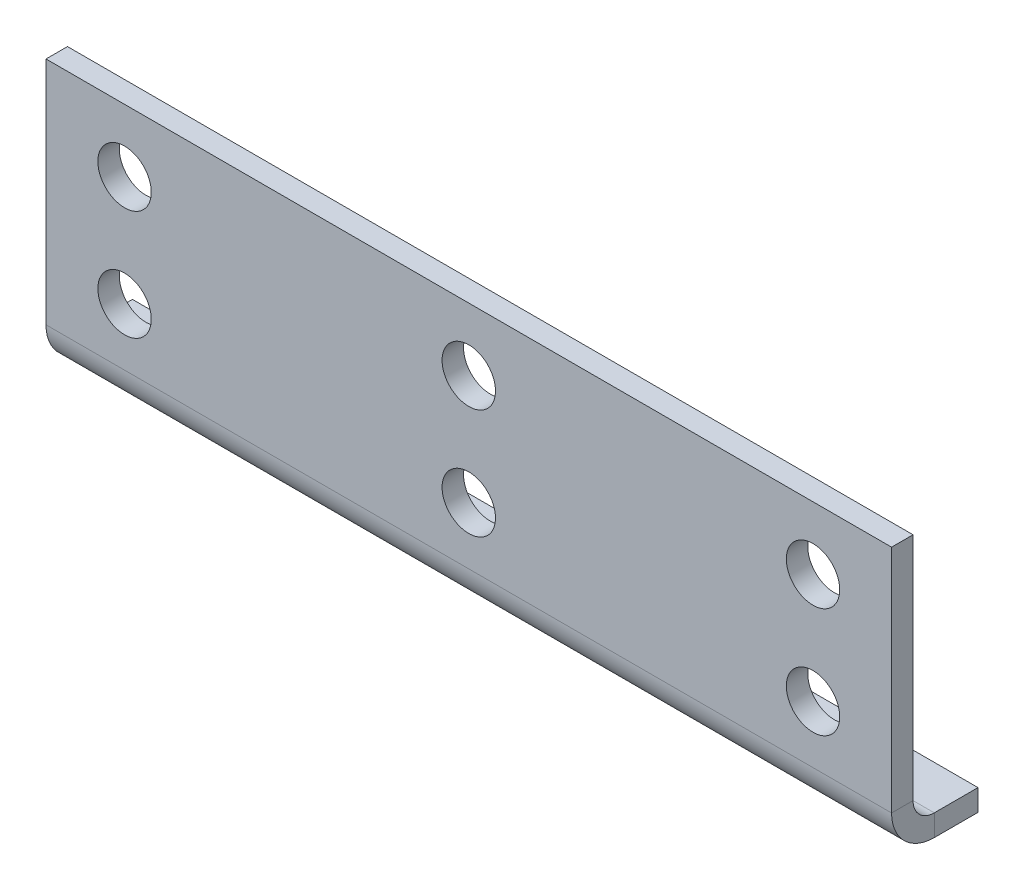
ISO-10303-21;
HEADER;
FILE_DESCRIPTION(('STEP AP214'),'2;1');
FILE_NAME('part.step','',(''),(''),'','','');
FILE_SCHEMA(('AUTOMOTIVE_DESIGN { 1 0 10303 214 1 1 1 1 }'));
ENDSEC;
DATA;
#1=APPLICATION_CONTEXT('core data for automotive mechanical design processes');
#2=APPLICATION_PROTOCOL_DEFINITION('international standard','automotive_design',2000,#1);
#3=PRODUCT_CONTEXT('',#1,'mechanical');
#4=PRODUCT('Part','Part','',(#3));
#5=PRODUCT_RELATED_PRODUCT_CATEGORY('part','',(#4));
#6=PRODUCT_DEFINITION_FORMATION('','',#4);
#7=PRODUCT_DEFINITION_CONTEXT('part definition',#1,'design');
#8=PRODUCT_DEFINITION('design','',#6,#7);
#9=PRODUCT_DEFINITION_SHAPE('','',#8);
#10=(LENGTH_UNIT() NAMED_UNIT(*) SI_UNIT(.MILLI.,.METRE.));
#11=(NAMED_UNIT(*) PLANE_ANGLE_UNIT() SI_UNIT($,.RADIAN.));
#12=(NAMED_UNIT(*) SI_UNIT($,.STERADIAN.) SOLID_ANGLE_UNIT());
#13=UNCERTAINTY_MEASURE_WITH_UNIT(LENGTH_MEASURE(1.E-05),#10,'distance_accuracy_value','');
#14=(GEOMETRIC_REPRESENTATION_CONTEXT(3) GLOBAL_UNCERTAINTY_ASSIGNED_CONTEXT((#13)) GLOBAL_UNIT_ASSIGNED_CONTEXT((#10,
#11,#12)) REPRESENTATION_CONTEXT('',''));
#15=CARTESIAN_POINT('',(0.,0.,0.));
#16=DIRECTION('',(0.,0.,1.));
#17=DIRECTION('',(1.,0.,0.));
#18=AXIS2_PLACEMENT_3D('',#15,#16,#17);
#19=CARTESIAN_POINT('',(-68.1750799947325,-93.4271681754315,1.4986));
#20=DIRECTION('',(1.,0.,0.));
#21=DIRECTION('',(0.,1.,0.));
#22=AXIS2_PLACEMENT_3D('',#19,#20,#21);
#23=PLANE('',#22);
#24=DIRECTION('',(0.,1.,0.));
#25=VECTOR('',#24,1.);
#26=CARTESIAN_POINT('',(-68.1750799947325,0.,0.1316));
#27=LINE('',#26,#25);
#28=CARTESIAN_POINT('',(-68.1750799947324,-92.0771681754315,0.131599999999991));
#29=VERTEX_POINT('',#28);
#30=CARTESIAN_POINT('',(-68.1750799947325,-77.4271681754315,0.1316));
#31=VERTEX_POINT('',#30);
#32=EDGE_CURVE('E174',#29,#31,#27,.T.);
#33=ORIENTED_EDGE('',*,*,#32,.F.);
#34=DIRECTION('',(0.,0.,1.));
#35=VECTOR('',#34,1.);
#36=CARTESIAN_POINT('',(-68.1750799947324,-92.0771681754315,0.131599999999991));
#37=LINE('',#36,#35);
#38=CARTESIAN_POINT('',(-68.1750799947324,-92.0771681754315,1.49859999999999));
#39=VERTEX_POINT('',#38);
#40=EDGE_CURVE('E121',#29,#39,#37,.T.);
#41=ORIENTED_EDGE('',*,*,#40,.T.);
#42=DIRECTION('',(0.,1.,0.));
#43=VECTOR('',#42,1.);
#44=CARTESIAN_POINT('',(-68.1750799947325,-93.4271681754315,1.4986));
#45=LINE('',#44,#43);
#46=CARTESIAN_POINT('',(-68.1750799947325,-77.4271681754315,1.4986));
#47=VERTEX_POINT('',#46);
#48=EDGE_CURVE('E62',#39,#47,#45,.T.);
#49=ORIENTED_EDGE('',*,*,#48,.T.);
#50=DIRECTION('',(0.,0.,1.));
#51=VECTOR('',#50,1.);
#52=CARTESIAN_POINT('',(-68.1750799947325,-77.4271681754315,1.4986));
#53=LINE('',#52,#51);
#54=EDGE_CURVE('E46',#31,#47,#53,.T.);
#55=ORIENTED_EDGE('',*,*,#54,.F.);
#56=EDGE_LOOP('',(#33,#41,#49,#55));
#57=FACE_BOUND('',#56,.T.);
#58=ADVANCED_FACE('F38',(#57),#23,.F.);
#59=CARTESIAN_POINT('',(0.,0.,1.4986));
#60=DIRECTION('',(0.,0.,1.));
#61=DIRECTION('',(1.,0.,0.));
#62=AXIS2_PLACEMENT_3D('',#59,#60,#61);
#63=PLANE('',#62);
#64=CARTESIAN_POINT('',(-19.3670799947325,-81.4271681754315,1.49860000000001));
#65=DIRECTION('',(0.,0.,-1.));
#66=DIRECTION('',(-1.,0.,0.));
#67=AXIS2_PLACEMENT_3D('',#64,#65,#66);
#68=CIRCLE('',#67,1.7);
#69=CARTESIAN_POINT('',(-21.0670799947325,-81.4271681754315,1.49860000000001));
#70=VERTEX_POINT('',#69);
#71=EDGE_CURVE('E252',#70,#70,#68,.T.);
#72=ORIENTED_EDGE('',*,*,#71,.T.);
#73=EDGE_LOOP('',(#72));
#74=FACE_BOUND('',#73,.T.);
#75=CARTESIAN_POINT('',(-19.3670799947324,-88.4271681754315,1.49860000000001));
#76=DIRECTION('',(0.,0.,-1.));
#77=DIRECTION('',(-1.,0.,0.));
#78=AXIS2_PLACEMENT_3D('',#75,#76,#77);
#79=CIRCLE('',#78,1.7);
#80=CARTESIAN_POINT('',(-21.0670799947324,-88.4271681754315,1.49860000000001));
#81=VERTEX_POINT('',#80);
#82=EDGE_CURVE('E248',#81,#81,#79,.T.);
#83=ORIENTED_EDGE('',*,*,#82,.T.);
#84=EDGE_LOOP('',(#83));
#85=FACE_BOUND('',#84,.T.);
#86=CARTESIAN_POINT('',(-63.1750799947324,-88.4271681754315,1.49860000000001));
#87=DIRECTION('',(0.,0.,-1.));
#88=DIRECTION('',(-1.,0.,0.));
#89=AXIS2_PLACEMENT_3D('',#86,#87,#88);
#90=CIRCLE('',#89,1.7);
#91=CARTESIAN_POINT('',(-64.8750799947324,-88.4271681754315,1.49860000000001));
#92=VERTEX_POINT('',#91);
#93=EDGE_CURVE('E244',#92,#92,#90,.T.);
#94=ORIENTED_EDGE('',*,*,#93,.T.);
#95=EDGE_LOOP('',(#94));
#96=FACE_BOUND('',#95,.T.);
#97=CARTESIAN_POINT('',(-63.1750799947325,-81.4271681754315,1.49860000000001));
#98=DIRECTION('',(0.,0.,-1.));
#99=DIRECTION('',(-1.,0.,0.));
#100=AXIS2_PLACEMENT_3D('',#97,#98,#99);
#101=CIRCLE('',#100,1.7);
#102=CARTESIAN_POINT('',(-64.8750799947325,-81.4271681754315,1.49860000000001));
#103=VERTEX_POINT('',#102);
#104=EDGE_CURVE('E240',#103,#103,#101,.T.);
#105=ORIENTED_EDGE('',*,*,#104,.T.);
#106=EDGE_LOOP('',(#105));
#107=FACE_BOUND('',#106,.T.);
#108=CARTESIAN_POINT('',(-41.2710799947324,-88.4271681754315,1.49860000000001));
#109=DIRECTION('',(0.,0.,-1.));
#110=DIRECTION('',(-1.,0.,0.));
#111=AXIS2_PLACEMENT_3D('',#108,#109,#110);
#112=CIRCLE('',#111,1.7);
#113=CARTESIAN_POINT('',(-42.9710799947324,-88.4271681754315,1.49860000000001));
#114=VERTEX_POINT('',#113);
#115=EDGE_CURVE('E233',#114,#114,#112,.T.);
#116=ORIENTED_EDGE('',*,*,#115,.T.);
#117=EDGE_LOOP('',(#116));
#118=FACE_BOUND('',#117,.T.);
#119=CARTESIAN_POINT('',(-41.2710799947325,-81.4271681754315,1.49860000000001));
#120=DIRECTION('',(0.,0.,-1.));
#121=DIRECTION('',(-1.,0.,0.));
#122=AXIS2_PLACEMENT_3D('',#119,#120,#121);
#123=CIRCLE('',#122,1.7);
#124=CARTESIAN_POINT('',(-42.9710799947325,-81.4271681754315,1.49860000000001));
#125=VERTEX_POINT('',#124);
#126=EDGE_CURVE('E147',#125,#125,#123,.T.);
#127=ORIENTED_EDGE('',*,*,#126,.T.);
#128=EDGE_LOOP('',(#127));
#129=FACE_BOUND('',#128,.T.);
#130=ORIENTED_EDGE('',*,*,#48,.F.);
#131=DIRECTION('',(-1.,0.,0.));
#132=VECTOR('',#131,1.);
#133=CARTESIAN_POINT('',(-68.1750799947325,-92.0771681754315,1.49859999999999));
#134=LINE('',#133,#132);
#135=CARTESIAN_POINT('',(-14.3670799947324,-92.0771681754315,1.4986));
#136=VERTEX_POINT('',#135);
#137=EDGE_CURVE('E82',#39,#136,#134,.F.);
#138=ORIENTED_EDGE('',*,*,#137,.T.);
#139=DIRECTION('',(0.,1.,0.));
#140=VECTOR('',#139,1.);
#141=CARTESIAN_POINT('',(-14.3670799947324,-93.4271681754315,1.4986));
#142=LINE('',#141,#140);
#143=CARTESIAN_POINT('',(-14.3670799947324,-77.4271681754315,1.4986));
#144=VERTEX_POINT('',#143);
#145=EDGE_CURVE('E171',#136,#144,#142,.T.);
#146=ORIENTED_EDGE('',*,*,#145,.T.);
#147=DIRECTION('',(1.,0.,0.));
#148=VECTOR('',#147,1.);
#149=CARTESIAN_POINT('',(-68.1750799947325,-77.4271681754315,1.4986));
#150=LINE('',#149,#148);
#151=EDGE_CURVE('E173',#47,#144,#150,.T.);
#152=ORIENTED_EDGE('',*,*,#151,.F.);
#153=EDGE_LOOP('',(#130,#138,#146,#152));
#154=FACE_BOUND('',#153,.T.);
#155=ADVANCED_FACE('F188',(#74,#85,#96,#107,#118,#129,#154),#63,.T.);
#156=CARTESIAN_POINT('',(0.,0.,0.1316));
#157=DIRECTION('',(0.,0.,1.));
#158=DIRECTION('',(1.,0.,0.));
#159=AXIS2_PLACEMENT_3D('',#156,#157,#158);
#160=PLANE('',#159);
#161=CARTESIAN_POINT('',(-19.3670799947325,-81.4271681754315,0.131599999999999));
#162=DIRECTION('',(0.,0.,-1.));
#163=DIRECTION('',(-1.,0.,0.));
#164=AXIS2_PLACEMENT_3D('',#161,#162,#163);
#165=CIRCLE('',#164,1.69999999999999);
#166=CARTESIAN_POINT('',(-21.0670799947324,-81.4271681754315,0.131599999999999));
#167=VERTEX_POINT('',#166);
#168=EDGE_CURVE('E212',#167,#167,#165,.T.);
#169=ORIENTED_EDGE('',*,*,#168,.F.);
#170=EDGE_LOOP('',(#169));
#171=FACE_BOUND('',#170,.T.);
#172=CARTESIAN_POINT('',(-19.3670799947324,-88.4271681754315,0.131599999999999));
#173=DIRECTION('',(0.,0.,-1.));
#174=DIRECTION('',(-1.,0.,0.));
#175=AXIS2_PLACEMENT_3D('',#172,#173,#174);
#176=CIRCLE('',#175,1.69999999999999);
#177=CARTESIAN_POINT('',(-21.0670799947324,-88.4271681754315,0.131599999999999));
#178=VERTEX_POINT('',#177);
#179=EDGE_CURVE('E216',#178,#178,#176,.T.);
#180=ORIENTED_EDGE('',*,*,#179,.F.);
#181=EDGE_LOOP('',(#180));
#182=FACE_BOUND('',#181,.T.);
#183=CARTESIAN_POINT('',(-63.1750799947324,-88.4271681754315,0.131599999999999));
#184=DIRECTION('',(0.,0.,-1.));
#185=DIRECTION('',(-1.,0.,0.));
#186=AXIS2_PLACEMENT_3D('',#183,#184,#185);
#187=CIRCLE('',#186,1.69999999999999);
#188=CARTESIAN_POINT('',(-64.8750799947324,-88.4271681754315,0.131599999999999));
#189=VERTEX_POINT('',#188);
#190=EDGE_CURVE('E220',#189,#189,#187,.T.);
#191=ORIENTED_EDGE('',*,*,#190,.F.);
#192=EDGE_LOOP('',(#191));
#193=FACE_BOUND('',#192,.T.);
#194=CARTESIAN_POINT('',(-63.1750799947325,-81.4271681754315,0.131599999999999));
#195=DIRECTION('',(0.,0.,-1.));
#196=DIRECTION('',(-1.,0.,0.));
#197=AXIS2_PLACEMENT_3D('',#194,#195,#196);
#198=CIRCLE('',#197,1.69999999999999);
#199=CARTESIAN_POINT('',(-64.8750799947324,-81.4271681754315,0.131599999999999));
#200=VERTEX_POINT('',#199);
#201=EDGE_CURVE('E224',#200,#200,#198,.T.);
#202=ORIENTED_EDGE('',*,*,#201,.F.);
#203=EDGE_LOOP('',(#202));
#204=FACE_BOUND('',#203,.T.);
#205=CARTESIAN_POINT('',(-41.2710799947324,-88.4271681754315,0.131599999999999));
#206=DIRECTION('',(0.,0.,-1.));
#207=DIRECTION('',(-1.,0.,0.));
#208=AXIS2_PLACEMENT_3D('',#205,#206,#207);
#209=CIRCLE('',#208,1.69999999999999);
#210=CARTESIAN_POINT('',(-42.9710799947324,-88.4271681754315,0.131599999999999));
#211=VERTEX_POINT('',#210);
#212=EDGE_CURVE('E228',#211,#211,#209,.T.);
#213=ORIENTED_EDGE('',*,*,#212,.F.);
#214=EDGE_LOOP('',(#213));
#215=FACE_BOUND('',#214,.T.);
#216=CARTESIAN_POINT('',(-41.2710799947325,-81.4271681754315,0.131599999999999));
#217=DIRECTION('',(0.,0.,-1.));
#218=DIRECTION('',(-1.,0.,0.));
#219=AXIS2_PLACEMENT_3D('',#216,#217,#218);
#220=CIRCLE('',#219,1.69999999999999);
#221=CARTESIAN_POINT('',(-42.9710799947324,-81.4271681754315,0.131599999999999));
#222=VERTEX_POINT('',#221);
#223=EDGE_CURVE('E231',#222,#222,#220,.T.);
#224=ORIENTED_EDGE('',*,*,#223,.F.);
#225=EDGE_LOOP('',(#224));
#226=FACE_BOUND('',#225,.T.);
#227=DIRECTION('',(-1.,0.,0.));
#228=VECTOR('',#227,1.);
#229=CARTESIAN_POINT('',(-68.1750799947325,-92.0771681754315,0.131599999999991));
#230=LINE('',#229,#228);
#231=CARTESIAN_POINT('',(-14.3670799947324,-92.0771681754315,0.131599999999991));
#232=VERTEX_POINT('',#231);
#233=EDGE_CURVE('E122',#29,#232,#230,.F.);
#234=ORIENTED_EDGE('',*,*,#233,.F.);
#235=ORIENTED_EDGE('',*,*,#32,.T.);
#236=DIRECTION('',(1.,0.,0.));
#237=VECTOR('',#236,1.);
#238=CARTESIAN_POINT('',(0.,-77.4271681754315,0.1316));
#239=LINE('',#238,#237);
#240=CARTESIAN_POINT('',(-14.3670799947324,-77.4271681754315,0.1316));
#241=VERTEX_POINT('',#240);
#242=EDGE_CURVE('E179',#31,#241,#239,.T.);
#243=ORIENTED_EDGE('',*,*,#242,.T.);
#244=DIRECTION('',(0.,1.,0.));
#245=VECTOR('',#244,1.);
#246=CARTESIAN_POINT('',(-14.3670799947324,0.,0.1316));
#247=LINE('',#246,#245);
#248=EDGE_CURVE('E76',#232,#241,#247,.T.);
#249=ORIENTED_EDGE('',*,*,#248,.F.);
#250=EDGE_LOOP('',(#234,#235,#243,#249));
#251=FACE_BOUND('',#250,.T.);
#252=ADVANCED_FACE('F191',(#171,#182,#193,#204,#215,#226,#251),#160,.F.);
#253=CARTESIAN_POINT('',(-68.1750799947325,-77.4271681754315,1.4986));
#254=DIRECTION('',(0.,-1.,0.));
#255=DIRECTION('',(1.,0.,0.));
#256=AXIS2_PLACEMENT_3D('',#253,#254,#255);
#257=PLANE('',#256);
#258=DIRECTION('',(0.,0.,1.));
#259=VECTOR('',#258,1.);
#260=CARTESIAN_POINT('',(-14.3670799947324,-77.4271681754315,1.4986));
#261=LINE('',#260,#259);
#262=EDGE_CURVE('E11',#241,#144,#261,.T.);
#263=ORIENTED_EDGE('',*,*,#262,.F.);
#264=ORIENTED_EDGE('',*,*,#242,.F.);
#265=ORIENTED_EDGE('',*,*,#54,.T.);
#266=ORIENTED_EDGE('',*,*,#151,.T.);
#267=EDGE_LOOP('',(#263,#264,#265,#266));
#268=FACE_BOUND('',#267,.T.);
#269=ADVANCED_FACE('F185',(#268),#257,.F.);
#270=CARTESIAN_POINT('',(-14.3670799947324,-93.4271681754315,1.4986));
#271=DIRECTION('',(1.,0.,0.));
#272=DIRECTION('',(0.,1.,0.));
#273=AXIS2_PLACEMENT_3D('',#270,#271,#272);
#274=PLANE('',#273);
#275=DIRECTION('',(0.,0.,1.));
#276=VECTOR('',#275,1.);
#277=CARTESIAN_POINT('',(-14.3670799947324,-92.0771681754315,0.131599999999991));
#278=LINE('',#277,#276);
#279=EDGE_CURVE('E168',#232,#136,#278,.T.);
#280=ORIENTED_EDGE('',*,*,#279,.F.);
#281=ORIENTED_EDGE('',*,*,#248,.T.);
#282=ORIENTED_EDGE('',*,*,#262,.T.);
#283=ORIENTED_EDGE('',*,*,#145,.F.);
#284=EDGE_LOOP('',(#280,#281,#282,#283));
#285=FACE_BOUND('',#284,.T.);
#286=ADVANCED_FACE('F40',(#285),#274,.T.);
#287=CARTESIAN_POINT('',(-14.3670799947324,-92.0771681754315,-1.2184));
#288=DIRECTION('',(1.,0.,0.));
#289=DIRECTION('',(0.,0.,-1.));
#290=AXIS2_PLACEMENT_3D('',#287,#288,#289);
#291=PLANE('',#290);
#292=DIRECTION('',(0.,-1.,0.));
#293=VECTOR('',#292,1.);
#294=CARTESIAN_POINT('',(-14.3670799947324,-93.4271681754315,-1.21839999999999));
#295=LINE('',#294,#293);
#296=CARTESIAN_POINT('',(-14.3670799947324,-93.4271681754315,-1.21839999999999));
#297=VERTEX_POINT('',#296);
#298=CARTESIAN_POINT('',(-14.3670799947324,-94.7941681754315,-1.21839999999999));
#299=VERTEX_POINT('',#298);
#300=EDGE_CURVE('E114',#297,#299,#295,.T.);
#301=ORIENTED_EDGE('',*,*,#300,.F.);
#302=CARTESIAN_POINT('',(-14.3670799947324,-92.0771681754315,-1.2184));
#303=DIRECTION('',(-1.,0.,0.));
#304=DIRECTION('',(0.,0.,1.));
#305=AXIS2_PLACEMENT_3D('',#302,#303,#304);
#306=CIRCLE('',#305,1.34999999999999);
#307=EDGE_CURVE('E108',#232,#297,#306,.F.);
#308=ORIENTED_EDGE('',*,*,#307,.F.);
#309=ORIENTED_EDGE('',*,*,#279,.T.);
#310=CARTESIAN_POINT('',(-14.3670799947324,-92.0771681754315,-1.2184));
#311=DIRECTION('',(-1.,0.,0.));
#312=DIRECTION('',(0.,0.,1.));
#313=AXIS2_PLACEMENT_3D('',#310,#311,#312);
#314=CIRCLE('',#313,2.71699999999999);
#315=EDGE_CURVE('E53',#136,#299,#314,.F.);
#316=ORIENTED_EDGE('',*,*,#315,.T.);
#317=EDGE_LOOP('',(#301,#308,#309,#316));
#318=FACE_BOUND('',#317,.T.);
#319=ADVANCED_FACE('F205',(#318),#291,.T.);
#320=CARTESIAN_POINT('',(-68.1750799947324,-92.0771681754315,-1.2184));
#321=DIRECTION('',(1.,0.,0.));
#322=DIRECTION('',(0.,0.,-1.));
#323=AXIS2_PLACEMENT_3D('',#320,#321,#322);
#324=PLANE('',#323);
#325=CARTESIAN_POINT('',(-68.1750799947324,-92.0771681754315,-1.2184));
#326=DIRECTION('',(-1.,0.,0.));
#327=DIRECTION('',(0.,0.,1.));
#328=AXIS2_PLACEMENT_3D('',#325,#326,#327);
#329=CIRCLE('',#328,1.34999999999999);
#330=CARTESIAN_POINT('',(-68.1750799947324,-93.4271681754315,-1.21839999999999));
#331=VERTEX_POINT('',#330);
#332=EDGE_CURVE('E105',#331,#29,#329,.T.);
#333=ORIENTED_EDGE('',*,*,#332,.F.);
#334=DIRECTION('',(0.,-1.,0.));
#335=VECTOR('',#334,1.);
#336=CARTESIAN_POINT('',(-68.1750799947324,-93.4271681754315,-1.21839999999999));
#337=LINE('',#336,#335);
#338=CARTESIAN_POINT('',(-68.1750799947324,-94.7941681754315,-1.21839999999999));
#339=VERTEX_POINT('',#338);
#340=EDGE_CURVE('E113',#331,#339,#337,.T.);
#341=ORIENTED_EDGE('',*,*,#340,.T.);
#342=CARTESIAN_POINT('',(-68.1750799947324,-92.0771681754315,-1.2184));
#343=DIRECTION('',(-1.,0.,0.));
#344=DIRECTION('',(0.,0.,1.));
#345=AXIS2_PLACEMENT_3D('',#342,#343,#344);
#346=CIRCLE('',#345,2.71699999999999);
#347=EDGE_CURVE('E163',#339,#39,#346,.T.);
#348=ORIENTED_EDGE('',*,*,#347,.T.);
#349=ORIENTED_EDGE('',*,*,#40,.F.);
#350=EDGE_LOOP('',(#333,#341,#348,#349));
#351=FACE_BOUND('',#350,.T.);
#352=ADVANCED_FACE('F118',(#351),#324,.F.);
#353=CARTESIAN_POINT('',(-68.1750799947325,-92.0771681754315,-1.2184));
#354=DIRECTION('',(-1.,0.,0.));
#355=DIRECTION('',(0.,-1.,0.));
#356=AXIS2_PLACEMENT_3D('',#353,#354,#355);
#357=CYLINDRICAL_SURFACE('',#356,2.71699999999999);
#358=ORIENTED_EDGE('',*,*,#137,.F.);
#359=ORIENTED_EDGE('',*,*,#347,.F.);
#360=DIRECTION('',(-1.,0.,0.));
#361=VECTOR('',#360,1.);
#362=CARTESIAN_POINT('',(0.,-94.7941681754315,-1.21839999999999));
#363=LINE('',#362,#361);
#364=EDGE_CURVE('E140',#299,#339,#363,.T.);
#365=ORIENTED_EDGE('',*,*,#364,.F.);
#366=ORIENTED_EDGE('',*,*,#315,.F.);
#367=EDGE_LOOP('',(#358,#359,#365,#366));
#368=FACE_BOUND('',#367,.T.);
#369=ADVANCED_FACE('F300',(#368),#357,.T.);
#370=CARTESIAN_POINT('',(-68.1750799947325,-92.0771681754315,-1.2184));
#371=DIRECTION('',(-1.,0.,0.));
#372=DIRECTION('',(0.,-1.,0.));
#373=AXIS2_PLACEMENT_3D('',#370,#371,#372);
#374=CYLINDRICAL_SURFACE('',#373,1.34999999999999);
#375=ORIENTED_EDGE('',*,*,#233,.T.);
#376=ORIENTED_EDGE('',*,*,#307,.T.);
#377=DIRECTION('',(-1.,0.,0.));
#378=VECTOR('',#377,1.);
#379=CARTESIAN_POINT('',(-14.3670799947324,-93.4271681754315,-1.21839999999999));
#380=LINE('',#379,#378);
#381=EDGE_CURVE('E102',#297,#331,#380,.T.);
#382=ORIENTED_EDGE('',*,*,#381,.T.);
#383=ORIENTED_EDGE('',*,*,#332,.T.);
#384=EDGE_LOOP('',(#375,#376,#382,#383));
#385=FACE_BOUND('',#384,.T.);
#386=ADVANCED_FACE('F104',(#385),#374,.F.);
#387=CARTESIAN_POINT('',(-68.1750799947325,-94.7941681754315,0.131600000000005));
#388=DIRECTION('',(-1.,0.,0.));
#389=DIRECTION('',(0.,0.,1.));
#390=AXIS2_PLACEMENT_3D('',#387,#388,#389);
#391=PLANE('',#390);
#392=DIRECTION('',(0.,0.,1.));
#393=VECTOR('',#392,1.);
#394=CARTESIAN_POINT('',(-68.1750799947325,-94.7941681754315,0.131600000000005));
#395=LINE('',#394,#393);
#396=CARTESIAN_POINT('',(-68.1750799947324,-94.7941681754315,-4.0014));
#397=VERTEX_POINT('',#396);
#398=EDGE_CURVE('E139',#397,#339,#395,.T.);
#399=ORIENTED_EDGE('',*,*,#398,.T.);
#400=ORIENTED_EDGE('',*,*,#340,.F.);
#401=DIRECTION('',(0.,0.,1.));
#402=VECTOR('',#401,1.);
#403=CARTESIAN_POINT('',(-68.1750799947325,-93.4271681754315,0.1316));
#404=LINE('',#403,#402);
#405=CARTESIAN_POINT('',(-68.1750799947324,-93.4271681754315,-4.0014));
#406=VERTEX_POINT('',#405);
#407=EDGE_CURVE('E127',#406,#331,#404,.T.);
#408=ORIENTED_EDGE('',*,*,#407,.F.);
#409=DIRECTION('',(0.,1.,0.));
#410=VECTOR('',#409,1.);
#411=CARTESIAN_POINT('',(-68.1750799947324,-94.7941681754315,-4.0014));
#412=LINE('',#411,#410);
#413=EDGE_CURVE('E123',#397,#406,#412,.T.);
#414=ORIENTED_EDGE('',*,*,#413,.F.);
#415=EDGE_LOOP('',(#399,#400,#408,#414));
#416=FACE_BOUND('',#415,.T.);
#417=ADVANCED_FACE('F137',(#416),#391,.T.);
#418=CARTESIAN_POINT('',(-14.3670799947324,-94.7941681754315,-4.0014));
#419=DIRECTION('',(1.,0.,0.));
#420=DIRECTION('',(0.,0.,-1.));
#421=AXIS2_PLACEMENT_3D('',#418,#419,#420);
#422=PLANE('',#421);
#423=DIRECTION('',(0.,0.,-1.));
#424=VECTOR('',#423,1.);
#425=CARTESIAN_POINT('',(-14.3670799947324,-93.4271681754315,-4.0014));
#426=LINE('',#425,#424);
#427=CARTESIAN_POINT('',(-14.3670799947324,-93.4271681754315,-4.0014));
#428=VERTEX_POINT('',#427);
#429=EDGE_CURVE('E142',#297,#428,#426,.T.);
#430=ORIENTED_EDGE('',*,*,#429,.F.);
#431=ORIENTED_EDGE('',*,*,#300,.T.);
#432=DIRECTION('',(0.,0.,-1.));
#433=VECTOR('',#432,1.);
#434=CARTESIAN_POINT('',(-14.3670799947324,-94.7941681754315,-4.0014));
#435=LINE('',#434,#433);
#436=CARTESIAN_POINT('',(-14.3670799947324,-94.7941681754315,-4.0014));
#437=VERTEX_POINT('',#436);
#438=EDGE_CURVE('E134',#299,#437,#435,.T.);
#439=ORIENTED_EDGE('',*,*,#438,.T.);
#440=DIRECTION('',(0.,1.,0.));
#441=VECTOR('',#440,1.);
#442=CARTESIAN_POINT('',(-14.3670799947324,-94.7941681754315,-4.0014));
#443=LINE('',#442,#441);
#444=EDGE_CURVE('E155',#437,#428,#443,.T.);
#445=ORIENTED_EDGE('',*,*,#444,.T.);
#446=EDGE_LOOP('',(#430,#431,#439,#445));
#447=FACE_BOUND('',#446,.T.);
#448=ADVANCED_FACE('F288',(#447),#422,.T.);
#449=CARTESIAN_POINT('',(0.,-94.7941681754315,3.18482609508377E-13));
#450=DIRECTION('',(0.,-1.,0.));
#451=DIRECTION('',(0.,0.,-1.));
#452=AXIS2_PLACEMENT_3D('',#449,#450,#451);
#453=PLANE('',#452);
#454=ORIENTED_EDGE('',*,*,#438,.F.);
#455=ORIENTED_EDGE('',*,*,#364,.T.);
#456=ORIENTED_EDGE('',*,*,#398,.F.);
#457=DIRECTION('',(-1.,0.,0.));
#458=VECTOR('',#457,1.);
#459=CARTESIAN_POINT('',(-68.1750799947324,-94.7941681754315,-4.0014));
#460=LINE('',#459,#458);
#461=EDGE_CURVE('E151',#437,#397,#460,.T.);
#462=ORIENTED_EDGE('',*,*,#461,.F.);
#463=EDGE_LOOP('',(#454,#455,#456,#462));
#464=FACE_BOUND('',#463,.T.);
#465=ADVANCED_FACE('F285',(#464),#453,.T.);
#466=CARTESIAN_POINT('',(0.,-93.4271681754315,3.13709754518179E-13));
#467=DIRECTION('',(0.,-1.,0.));
#468=DIRECTION('',(0.,0.,-1.));
#469=AXIS2_PLACEMENT_3D('',#466,#467,#468);
#470=PLANE('',#469);
#471=ORIENTED_EDGE('',*,*,#381,.F.);
#472=ORIENTED_EDGE('',*,*,#429,.T.);
#473=DIRECTION('',(-1.,0.,0.));
#474=VECTOR('',#473,1.);
#475=CARTESIAN_POINT('',(-68.1750799947324,-93.4271681754315,-4.0014));
#476=LINE('',#475,#474);
#477=EDGE_CURVE('E131',#428,#406,#476,.T.);
#478=ORIENTED_EDGE('',*,*,#477,.T.);
#479=ORIENTED_EDGE('',*,*,#407,.T.);
#480=EDGE_LOOP('',(#471,#472,#478,#479));
#481=FACE_BOUND('',#480,.T.);
#482=ADVANCED_FACE('F128',(#481),#470,.F.);
#483=CARTESIAN_POINT('',(-68.1750799947324,-94.7941681754315,-4.0014));
#484=DIRECTION('',(0.,0.,-1.));
#485=DIRECTION('',(0.,1.,0.));
#486=AXIS2_PLACEMENT_3D('',#483,#484,#485);
#487=PLANE('',#486);
#488=ORIENTED_EDGE('',*,*,#477,.F.);
#489=ORIENTED_EDGE('',*,*,#444,.F.);
#490=ORIENTED_EDGE('',*,*,#461,.T.);
#491=ORIENTED_EDGE('',*,*,#413,.T.);
#492=EDGE_LOOP('',(#488,#489,#490,#491));
#493=FACE_BOUND('',#492,.T.);
#494=ADVANCED_FACE('F283',(#493),#487,.T.);
#495=CARTESIAN_POINT('',(-41.2710799947325,-81.4271681754315,0.1316));
#496=DIRECTION('',(0.,0.,-1.));
#497=DIRECTION('',(-1.,0.,0.));
#498=AXIS2_PLACEMENT_3D('',#495,#496,#497);
#499=CYLINDRICAL_SURFACE('',#498,1.69999999999999);
#500=ORIENTED_EDGE('',*,*,#126,.F.);
#501=EDGE_LOOP('',(#500));
#502=FACE_BOUND('',#501,.T.);
#503=ORIENTED_EDGE('',*,*,#223,.T.);
#504=EDGE_LOOP('',(#503));
#505=FACE_BOUND('',#504,.T.);
#506=ADVANCED_FACE('F279',(#502,#505),#499,.F.);
#507=CARTESIAN_POINT('',(-41.2710799947324,-88.4271681754315,0.1316));
#508=DIRECTION('',(0.,0.,-1.));
#509=DIRECTION('',(-1.,0.,0.));
#510=AXIS2_PLACEMENT_3D('',#507,#508,#509);
#511=CYLINDRICAL_SURFACE('',#510,1.69999999999999);
#512=ORIENTED_EDGE('',*,*,#115,.F.);
#513=EDGE_LOOP('',(#512));
#514=FACE_BOUND('',#513,.T.);
#515=ORIENTED_EDGE('',*,*,#212,.T.);
#516=EDGE_LOOP('',(#515));
#517=FACE_BOUND('',#516,.T.);
#518=ADVANCED_FACE('F275',(#514,#517),#511,.F.);
#519=CARTESIAN_POINT('',(-63.1750799947325,-81.4271681754315,0.1316));
#520=DIRECTION('',(0.,0.,-1.));
#521=DIRECTION('',(-1.,0.,0.));
#522=AXIS2_PLACEMENT_3D('',#519,#520,#521);
#523=CYLINDRICAL_SURFACE('',#522,1.69999999999999);
#524=ORIENTED_EDGE('',*,*,#104,.F.);
#525=EDGE_LOOP('',(#524));
#526=FACE_BOUND('',#525,.T.);
#527=ORIENTED_EDGE('',*,*,#201,.T.);
#528=EDGE_LOOP('',(#527));
#529=FACE_BOUND('',#528,.T.);
#530=ADVANCED_FACE('F271',(#526,#529),#523,.F.);
#531=CARTESIAN_POINT('',(-63.1750799947324,-88.4271681754315,0.1316));
#532=DIRECTION('',(0.,0.,-1.));
#533=DIRECTION('',(-1.,0.,0.));
#534=AXIS2_PLACEMENT_3D('',#531,#532,#533);
#535=CYLINDRICAL_SURFACE('',#534,1.69999999999999);
#536=ORIENTED_EDGE('',*,*,#93,.F.);
#537=EDGE_LOOP('',(#536));
#538=FACE_BOUND('',#537,.T.);
#539=ORIENTED_EDGE('',*,*,#190,.T.);
#540=EDGE_LOOP('',(#539));
#541=FACE_BOUND('',#540,.T.);
#542=ADVANCED_FACE('F264',(#538,#541),#535,.F.);
#543=CARTESIAN_POINT('',(-19.3670799947324,-88.4271681754315,0.1316));
#544=DIRECTION('',(0.,0.,-1.));
#545=DIRECTION('',(-1.,0.,0.));
#546=AXIS2_PLACEMENT_3D('',#543,#544,#545);
#547=CYLINDRICAL_SURFACE('',#546,1.69999999999999);
#548=ORIENTED_EDGE('',*,*,#82,.F.);
#549=EDGE_LOOP('',(#548));
#550=FACE_BOUND('',#549,.T.);
#551=ORIENTED_EDGE('',*,*,#179,.T.);
#552=EDGE_LOOP('',(#551));
#553=FACE_BOUND('',#552,.T.);
#554=ADVANCED_FACE('F258',(#550,#553),#547,.F.);
#555=CARTESIAN_POINT('',(-19.3670799947325,-81.4271681754315,0.1316));
#556=DIRECTION('',(0.,0.,-1.));
#557=DIRECTION('',(-1.,0.,0.));
#558=AXIS2_PLACEMENT_3D('',#555,#556,#557);
#559=CYLINDRICAL_SURFACE('',#558,1.69999999999999);
#560=ORIENTED_EDGE('',*,*,#71,.F.);
#561=EDGE_LOOP('',(#560));
#562=FACE_BOUND('',#561,.T.);
#563=ORIENTED_EDGE('',*,*,#168,.T.);
#564=EDGE_LOOP('',(#563));
#565=FACE_BOUND('',#564,.T.);
#566=ADVANCED_FACE('F256',(#562,#565),#559,.F.);
#567=CLOSED_SHELL('',(#58,#155,#252,#269,#286,#319,#352,#369,#386,#417,#448,#465,#482,#494,#506,
#518,#530,#542,#554,#566));
#568=MANIFOLD_SOLID_BREP('B2',#567);
#569=ADVANCED_BREP_SHAPE_REPRESENTATION('',(#18,#568),#14);
#570=SHAPE_DEFINITION_REPRESENTATION(#9,#569);
ENDSEC;
END-ISO-10303-21;
